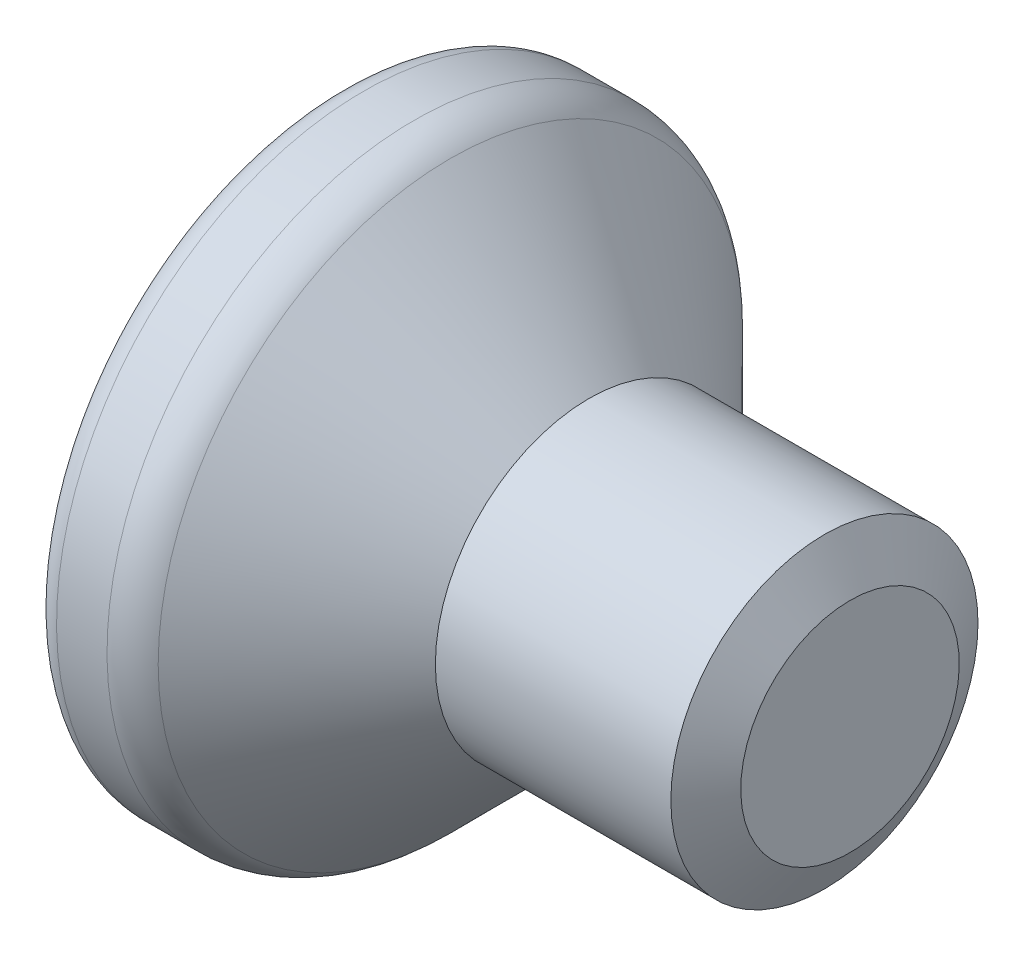
ISO-10303-21;
HEADER;
FILE_DESCRIPTION(('STEP AP214'),'2;1');
FILE_NAME('part.step','',(''),(''),'','','');
FILE_SCHEMA(('AUTOMOTIVE_DESIGN { 1 0 10303 214 1 1 1 1 }'));
ENDSEC;
DATA;
#1=APPLICATION_CONTEXT('core data for automotive mechanical design processes');
#2=APPLICATION_PROTOCOL_DEFINITION('international standard','automotive_design',2000,#1);
#3=PRODUCT_CONTEXT('',#1,'mechanical');
#4=PRODUCT('Part','Part','',(#3));
#5=PRODUCT_RELATED_PRODUCT_CATEGORY('part','',(#4));
#6=PRODUCT_DEFINITION_FORMATION('','',#4);
#7=PRODUCT_DEFINITION_CONTEXT('part definition',#1,'design');
#8=PRODUCT_DEFINITION('design','',#6,#7);
#9=PRODUCT_DEFINITION_SHAPE('','',#8);
#10=(LENGTH_UNIT() NAMED_UNIT(*) SI_UNIT(.MILLI.,.METRE.));
#11=(NAMED_UNIT(*) PLANE_ANGLE_UNIT() SI_UNIT($,.RADIAN.));
#12=(NAMED_UNIT(*) SI_UNIT($,.STERADIAN.) SOLID_ANGLE_UNIT());
#13=UNCERTAINTY_MEASURE_WITH_UNIT(LENGTH_MEASURE(1.E-05),#10,'distance_accuracy_value','');
#14=(GEOMETRIC_REPRESENTATION_CONTEXT(3) GLOBAL_UNCERTAINTY_ASSIGNED_CONTEXT((#13)) GLOBAL_UNIT_ASSIGNED_CONTEXT((#10,
#11,#12)) REPRESENTATION_CONTEXT('',''));
#15=CARTESIAN_POINT('',(0.,0.,0.));
#16=DIRECTION('',(0.,0.,1.));
#17=DIRECTION('',(1.,0.,0.));
#18=AXIS2_PLACEMENT_3D('',#15,#16,#17);
#19=CARTESIAN_POINT('',(5.,0.,0.));
#20=DIRECTION('',(1.,0.,0.));
#21=DIRECTION('',(0.,1.,0.));
#22=AXIS2_PLACEMENT_3D('',#19,#20,#21);
#23=CYLINDRICAL_SURFACE('',#22,6.);
#24=CARTESIAN_POINT('',(-3.51421356237312,0.,0.));
#25=DIRECTION('',(-1.,0.,0.));
#26=DIRECTION('',(0.,-1.,0.));
#27=AXIS2_PLACEMENT_3D('',#24,#25,#26);
#28=CIRCLE('',#27,6.);
#29=CARTESIAN_POINT('',(-3.51421356237312,-6.,0.));
#30=VERTEX_POINT('',#29);
#31=EDGE_CURVE('E154',#30,#30,#28,.T.);
#32=ORIENTED_EDGE('',*,*,#31,.T.);
#33=EDGE_LOOP('',(#32));
#34=FACE_BOUND('',#33,.T.);
#35=CARTESIAN_POINT('',(-4.5,0.,0.));
#36=DIRECTION('',(-1.,0.,0.));
#37=DIRECTION('',(0.,-1.,0.));
#38=AXIS2_PLACEMENT_3D('',#35,#36,#37);
#39=CIRCLE('',#38,6.);
#40=CARTESIAN_POINT('',(-4.5,-6.,0.));
#41=VERTEX_POINT('',#40);
#42=EDGE_CURVE('E145',#41,#41,#39,.F.);
#43=ORIENTED_EDGE('',*,*,#42,.T.);
#44=EDGE_LOOP('',(#43));
#45=FACE_BOUND('',#44,.T.);
#46=ADVANCED_FACE('F34',(#34,#45),#23,.T.);
#47=CARTESIAN_POINT('',(-0.0999999999999985,0.,0.));
#48=DIRECTION('',(-1.,0.,0.));
#49=DIRECTION('',(0.,-1.,0.));
#50=AXIS2_PLACEMENT_3D('',#47,#48,#49);
#51=CONICAL_SURFACE('',#50,3.,0.785398163397443);
#52=CARTESIAN_POINT('',(-2.80710678118658,0.,0.));
#53=DIRECTION('',(1.,0.,0.));
#54=DIRECTION('',(0.,1.,0.));
#55=AXIS2_PLACEMENT_3D('',#52,#53,#54);
#56=CIRCLE('',#55,5.70710678118655);
#57=CARTESIAN_POINT('',(-2.80710678118658,5.70710678118655,0.));
#58=VERTEX_POINT('',#57);
#59=EDGE_CURVE('E151',#58,#58,#56,.T.);
#60=ORIENTED_EDGE('',*,*,#59,.T.);
#61=EDGE_LOOP('',(#60));
#62=FACE_BOUND('',#61,.T.);
#63=CARTESIAN_POINT('',(-0.0999999999999985,0.,0.));
#64=DIRECTION('',(1.,0.,0.));
#65=DIRECTION('',(0.,1.,0.));
#66=AXIS2_PLACEMENT_3D('',#63,#64,#65);
#67=CIRCLE('',#66,3.);
#68=CARTESIAN_POINT('',(-0.0999999999999995,3.,0.));
#69=VERTEX_POINT('',#68);
#70=EDGE_CURVE('E137',#69,#69,#67,.T.);
#71=ORIENTED_EDGE('',*,*,#70,.F.);
#72=EDGE_LOOP('',(#71));
#73=FACE_BOUND('',#72,.T.);
#74=ADVANCED_FACE('F170',(#62,#73),#51,.T.);
#75=CARTESIAN_POINT('',(5.,0.,0.));
#76=DIRECTION('',(1.,0.,0.));
#77=DIRECTION('',(0.,1.,0.));
#78=AXIS2_PLACEMENT_3D('',#75,#76,#77);
#79=CYLINDRICAL_SURFACE('',#78,3.);
#80=CARTESIAN_POINT('',(4.5,0.,0.));
#81=DIRECTION('',(1.,0.,0.));
#82=DIRECTION('',(0.,1.,0.));
#83=AXIS2_PLACEMENT_3D('',#80,#81,#82);
#84=CIRCLE('',#83,3.);
#85=CARTESIAN_POINT('',(4.5,3.,0.));
#86=VERTEX_POINT('',#85);
#87=EDGE_CURVE('E11',#86,#86,#84,.F.);
#88=ORIENTED_EDGE('',*,*,#87,.T.);
#89=EDGE_LOOP('',(#88));
#90=FACE_BOUND('',#89,.T.);
#91=ORIENTED_EDGE('',*,*,#70,.T.);
#92=EDGE_LOOP('',(#91));
#93=FACE_BOUND('',#92,.T.);
#94=ADVANCED_FACE('F176',(#90,#93),#79,.T.);
#95=CARTESIAN_POINT('',(5.,3.,0.));
#96=DIRECTION('',(1.,0.,0.));
#97=DIRECTION('',(0.,1.,0.));
#98=AXIS2_PLACEMENT_3D('',#95,#96,#97);
#99=PLANE('',#98);
#100=CARTESIAN_POINT('',(5.,0.,0.));
#101=DIRECTION('',(1.,0.,0.));
#102=DIRECTION('',(0.,1.,0.));
#103=AXIS2_PLACEMENT_3D('',#100,#101,#102);
#104=CIRCLE('',#103,2.13397459621556);
#105=CARTESIAN_POINT('',(5.,2.13397459621556,0.));
#106=VERTEX_POINT('',#105);
#107=EDGE_CURVE('E43',#106,#106,#104,.T.);
#108=ORIENTED_EDGE('',*,*,#107,.T.);
#109=EDGE_LOOP('',(#108));
#110=FACE_BOUND('',#109,.T.);
#111=ADVANCED_FACE('F159',(#110),#99,.T.);
#112=CARTESIAN_POINT('',(-5.,0.,0.));
#113=DIRECTION('',(-1.,0.,0.));
#114=DIRECTION('',(0.,-1.,0.));
#115=AXIS2_PLACEMENT_3D('',#112,#113,#114);
#116=PLANE('',#115);
#117=DIRECTION('',(0.,0.5,-0.866025403784439));
#118=VECTOR('',#117,1.);
#119=CARTESIAN_POINT('',(-5.,1.15470053837925,2.));
#120=LINE('',#119,#118);
#121=CARTESIAN_POINT('',(-5.,1.15470053837925,2.));
#122=VERTEX_POINT('',#121);
#123=CARTESIAN_POINT('',(-5.,2.3094010767585,0.));
#124=VERTEX_POINT('',#123);
#125=EDGE_CURVE('E50',#122,#124,#120,.T.);
#126=ORIENTED_EDGE('',*,*,#125,.F.);
#127=DIRECTION('',(0.,1.,0.));
#128=VECTOR('',#127,1.);
#129=CARTESIAN_POINT('',(-5.,-1.15470053837925,2.));
#130=LINE('',#129,#128);
#131=CARTESIAN_POINT('',(-5.,-1.15470053837925,2.));
#132=VERTEX_POINT('',#131);
#133=EDGE_CURVE('E133',#132,#122,#130,.T.);
#134=ORIENTED_EDGE('',*,*,#133,.F.);
#135=DIRECTION('',(0.,0.5,0.866025403784439));
#136=VECTOR('',#135,1.);
#137=CARTESIAN_POINT('',(-5.,-2.30940107675851,0.));
#138=LINE('',#137,#136);
#139=CARTESIAN_POINT('',(-5.,-2.30940107675851,0.));
#140=VERTEX_POINT('',#139);
#141=EDGE_CURVE('E131',#140,#132,#138,.T.);
#142=ORIENTED_EDGE('',*,*,#141,.F.);
#143=DIRECTION('',(0.,-0.5,0.866025403784439));
#144=VECTOR('',#143,1.);
#145=CARTESIAN_POINT('',(-5.,-1.15470053837925,-2.));
#146=LINE('',#145,#144);
#147=CARTESIAN_POINT('',(-5.,-1.15470053837925,-2.));
#148=VERTEX_POINT('',#147);
#149=EDGE_CURVE('E98',#148,#140,#146,.T.);
#150=ORIENTED_EDGE('',*,*,#149,.F.);
#151=DIRECTION('',(0.,-1.,0.));
#152=VECTOR('',#151,1.);
#153=CARTESIAN_POINT('',(-5.,1.15470053837925,-2.));
#154=LINE('',#153,#152);
#155=CARTESIAN_POINT('',(-5.,1.15470053837925,-2.));
#156=VERTEX_POINT('',#155);
#157=EDGE_CURVE('E127',#156,#148,#154,.T.);
#158=ORIENTED_EDGE('',*,*,#157,.F.);
#159=DIRECTION('',(0.,-0.5,-0.866025403784439));
#160=VECTOR('',#159,1.);
#161=CARTESIAN_POINT('',(-5.,2.3094010767585,0.));
#162=LINE('',#161,#160);
#163=EDGE_CURVE('E124',#124,#156,#162,.T.);
#164=ORIENTED_EDGE('',*,*,#163,.F.);
#165=EDGE_LOOP('',(#126,#134,#142,#150,#158,#164));
#166=FACE_BOUND('',#165,.T.);
#167=CARTESIAN_POINT('',(-5.,0.,0.));
#168=DIRECTION('',(-1.,0.,0.));
#169=DIRECTION('',(0.,-1.,0.));
#170=AXIS2_PLACEMENT_3D('',#167,#168,#169);
#171=CIRCLE('',#170,5.5);
#172=CARTESIAN_POINT('',(-5.,-5.5,0.));
#173=VERTEX_POINT('',#172);
#174=EDGE_CURVE('E148',#173,#173,#171,.T.);
#175=ORIENTED_EDGE('',*,*,#174,.T.);
#176=EDGE_LOOP('',(#175));
#177=FACE_BOUND('',#176,.T.);
#178=ADVANCED_FACE('F185',(#166,#177),#116,.T.);
#179=CARTESIAN_POINT('',(-4.5,0.,0.));
#180=DIRECTION('',(-1.,0.,0.));
#181=DIRECTION('',(0.,-1.,0.));
#182=AXIS2_PLACEMENT_3D('',#179,#180,#181);
#183=TOROIDAL_SURFACE('',#182,5.5,0.5);
#184=ORIENTED_EDGE('',*,*,#174,.F.);
#185=EDGE_LOOP('',(#184));
#186=FACE_BOUND('',#185,.T.);
#187=ORIENTED_EDGE('',*,*,#42,.F.);
#188=EDGE_LOOP('',(#187));
#189=FACE_BOUND('',#188,.T.);
#190=ADVANCED_FACE('F182',(#186,#189),#183,.T.);
#191=CARTESIAN_POINT('',(-3.51421356237312,0.,0.));
#192=DIRECTION('',(-1.,0.,0.));
#193=DIRECTION('',(0.,-1.,0.));
#194=AXIS2_PLACEMENT_3D('',#191,#192,#193);
#195=TOROIDAL_SURFACE('',#194,5.,1.);
#196=ORIENTED_EDGE('',*,*,#31,.F.);
#197=EDGE_LOOP('',(#196));
#198=FACE_BOUND('',#197,.T.);
#199=ORIENTED_EDGE('',*,*,#59,.F.);
#200=EDGE_LOOP('',(#199));
#201=FACE_BOUND('',#200,.T.);
#202=ADVANCED_FACE('F184',(#198,#201),#195,.T.);
#203=CARTESIAN_POINT('',(-2.5,1.15470053837925,2.));
#204=DIRECTION('',(0.,0.866025403784439,0.5));
#205=DIRECTION('',(0.,-0.5,0.866025403784439));
#206=AXIS2_PLACEMENT_3D('',#203,#204,#205);
#207=PLANE('',#206);
#208=ORIENTED_EDGE('',*,*,#125,.T.);
#209=DIRECTION('',(-1.,0.,0.));
#210=VECTOR('',#209,1.);
#211=CARTESIAN_POINT('',(-2.5,2.3094010767585,0.));
#212=LINE('',#211,#210);
#213=CARTESIAN_POINT('',(-2.5,2.3094010767585,0.));
#214=VERTEX_POINT('',#213);
#215=EDGE_CURVE('E80',#214,#124,#212,.T.);
#216=ORIENTED_EDGE('',*,*,#215,.F.);
#217=DIRECTION('',(0.,0.5,-0.866025403784439));
#218=VECTOR('',#217,1.);
#219=CARTESIAN_POINT('',(-2.5,1.15470053837925,2.));
#220=LINE('',#219,#218);
#221=CARTESIAN_POINT('',(-2.5,1.15470053837925,2.));
#222=VERTEX_POINT('',#221);
#223=EDGE_CURVE('E135',#222,#214,#220,.T.);
#224=ORIENTED_EDGE('',*,*,#223,.F.);
#225=DIRECTION('',(-1.,0.,0.));
#226=VECTOR('',#225,1.);
#227=CARTESIAN_POINT('',(-2.5,1.15470053837925,2.));
#228=LINE('',#227,#226);
#229=EDGE_CURVE('E58',#222,#122,#228,.T.);
#230=ORIENTED_EDGE('',*,*,#229,.T.);
#231=EDGE_LOOP('',(#208,#216,#224,#230));
#232=FACE_BOUND('',#231,.T.);
#233=ADVANCED_FACE('F188',(#232),#207,.F.);
#234=CARTESIAN_POINT('',(-2.5,-1.15470053837925,2.));
#235=DIRECTION('',(0.,0.,1.));
#236=DIRECTION('',(0.,-1.,0.));
#237=AXIS2_PLACEMENT_3D('',#234,#235,#236);
#238=PLANE('',#237);
#239=ORIENTED_EDGE('',*,*,#133,.T.);
#240=ORIENTED_EDGE('',*,*,#229,.F.);
#241=DIRECTION('',(0.,1.,0.));
#242=VECTOR('',#241,1.);
#243=CARTESIAN_POINT('',(-2.5,-1.15470053837925,2.));
#244=LINE('',#243,#242);
#245=CARTESIAN_POINT('',(-2.5,-1.15470053837925,2.));
#246=VERTEX_POINT('',#245);
#247=EDGE_CURVE('E110',#246,#222,#244,.T.);
#248=ORIENTED_EDGE('',*,*,#247,.F.);
#249=DIRECTION('',(-1.,0.,0.));
#250=VECTOR('',#249,1.);
#251=CARTESIAN_POINT('',(-2.5,-1.15470053837925,2.));
#252=LINE('',#251,#250);
#253=EDGE_CURVE('E102',#246,#132,#252,.T.);
#254=ORIENTED_EDGE('',*,*,#253,.T.);
#255=EDGE_LOOP('',(#239,#240,#248,#254));
#256=FACE_BOUND('',#255,.T.);
#257=ADVANCED_FACE('F193',(#256),#238,.F.);
#258=CARTESIAN_POINT('',(-2.5,-2.3094010767585,0.));
#259=DIRECTION('',(0.,-0.866025403784439,0.5));
#260=DIRECTION('',(0.,-0.5,-0.866025403784439));
#261=AXIS2_PLACEMENT_3D('',#258,#259,#260);
#262=PLANE('',#261);
#263=ORIENTED_EDGE('',*,*,#141,.T.);
#264=ORIENTED_EDGE('',*,*,#253,.F.);
#265=DIRECTION('',(0.,0.5,0.866025403784439));
#266=VECTOR('',#265,1.);
#267=CARTESIAN_POINT('',(-2.5,-2.3094010767585,0.));
#268=LINE('',#267,#266);
#269=CARTESIAN_POINT('',(-2.5,-2.3094010767585,0.));
#270=VERTEX_POINT('',#269);
#271=EDGE_CURVE('E106',#270,#246,#268,.T.);
#272=ORIENTED_EDGE('',*,*,#271,.F.);
#273=DIRECTION('',(-1.,0.,0.));
#274=VECTOR('',#273,1.);
#275=CARTESIAN_POINT('',(-2.5,-2.3094010767585,0.));
#276=LINE('',#275,#274);
#277=EDGE_CURVE('E91',#270,#140,#276,.T.);
#278=ORIENTED_EDGE('',*,*,#277,.T.);
#279=EDGE_LOOP('',(#263,#264,#272,#278));
#280=FACE_BOUND('',#279,.T.);
#281=ADVANCED_FACE('F107',(#280),#262,.F.);
#282=CARTESIAN_POINT('',(-2.5,-1.15470053837925,-2.));
#283=DIRECTION('',(0.,-0.866025403784439,-0.5));
#284=DIRECTION('',(0.,0.5,-0.866025403784439));
#285=AXIS2_PLACEMENT_3D('',#282,#283,#284);
#286=PLANE('',#285);
#287=ORIENTED_EDGE('',*,*,#149,.T.);
#288=ORIENTED_EDGE('',*,*,#277,.F.);
#289=DIRECTION('',(0.,-0.5,0.866025403784439));
#290=VECTOR('',#289,1.);
#291=CARTESIAN_POINT('',(-2.5,-1.15470053837925,-2.));
#292=LINE('',#291,#290);
#293=CARTESIAN_POINT('',(-2.5,-1.15470053837925,-2.));
#294=VERTEX_POINT('',#293);
#295=EDGE_CURVE('E95',#294,#270,#292,.T.);
#296=ORIENTED_EDGE('',*,*,#295,.F.);
#297=DIRECTION('',(-1.,0.,0.));
#298=VECTOR('',#297,1.);
#299=CARTESIAN_POINT('',(-2.5,-1.15470053837925,-2.));
#300=LINE('',#299,#298);
#301=EDGE_CURVE('E103',#294,#148,#300,.T.);
#302=ORIENTED_EDGE('',*,*,#301,.T.);
#303=EDGE_LOOP('',(#287,#288,#296,#302));
#304=FACE_BOUND('',#303,.T.);
#305=ADVANCED_FACE('F93',(#304),#286,.F.);
#306=CARTESIAN_POINT('',(-2.5,1.15470053837925,-2.));
#307=DIRECTION('',(0.,0.,-1.));
#308=DIRECTION('',(-1.,0.,0.));
#309=AXIS2_PLACEMENT_3D('',#306,#307,#308);
#310=PLANE('',#309);
#311=ORIENTED_EDGE('',*,*,#157,.T.);
#312=ORIENTED_EDGE('',*,*,#301,.F.);
#313=DIRECTION('',(0.,-1.,0.));
#314=VECTOR('',#313,1.);
#315=CARTESIAN_POINT('',(-2.5,1.15470053837925,-2.));
#316=LINE('',#315,#314);
#317=CARTESIAN_POINT('',(-2.5,1.15470053837925,-2.));
#318=VERTEX_POINT('',#317);
#319=EDGE_CURVE('E116',#318,#294,#316,.T.);
#320=ORIENTED_EDGE('',*,*,#319,.F.);
#321=DIRECTION('',(-1.,0.,0.));
#322=VECTOR('',#321,1.);
#323=CARTESIAN_POINT('',(-2.5,1.15470053837925,-2.));
#324=LINE('',#323,#322);
#325=EDGE_CURVE('E140',#318,#156,#324,.T.);
#326=ORIENTED_EDGE('',*,*,#325,.T.);
#327=EDGE_LOOP('',(#311,#312,#320,#326));
#328=FACE_BOUND('',#327,.T.);
#329=ADVANCED_FACE('F213',(#328),#310,.F.);
#330=CARTESIAN_POINT('',(-2.5,2.3094010767585,0.));
#331=DIRECTION('',(0.,0.866025403784439,-0.5));
#332=DIRECTION('',(0.,0.5,0.866025403784439));
#333=AXIS2_PLACEMENT_3D('',#330,#331,#332);
#334=PLANE('',#333);
#335=ORIENTED_EDGE('',*,*,#163,.T.);
#336=ORIENTED_EDGE('',*,*,#325,.F.);
#337=DIRECTION('',(0.,-0.5,-0.866025403784439));
#338=VECTOR('',#337,1.);
#339=CARTESIAN_POINT('',(-2.5,2.3094010767585,0.));
#340=LINE('',#339,#338);
#341=EDGE_CURVE('E118',#214,#318,#340,.T.);
#342=ORIENTED_EDGE('',*,*,#341,.F.);
#343=ORIENTED_EDGE('',*,*,#215,.T.);
#344=EDGE_LOOP('',(#335,#336,#342,#343));
#345=FACE_BOUND('',#344,.T.);
#346=ADVANCED_FACE('F166',(#345),#334,.F.);
#347=CARTESIAN_POINT('',(-2.5,0.,0.));
#348=DIRECTION('',(-1.,0.,0.));
#349=DIRECTION('',(0.,-1.,0.));
#350=AXIS2_PLACEMENT_3D('',#347,#348,#349);
#351=PLANE('',#350);
#352=ORIENTED_EDGE('',*,*,#223,.T.);
#353=ORIENTED_EDGE('',*,*,#341,.T.);
#354=ORIENTED_EDGE('',*,*,#319,.T.);
#355=ORIENTED_EDGE('',*,*,#295,.T.);
#356=ORIENTED_EDGE('',*,*,#271,.T.);
#357=ORIENTED_EDGE('',*,*,#247,.T.);
#358=EDGE_LOOP('',(#352,#353,#354,#355,#356,#357));
#359=FACE_BOUND('',#358,.T.);
#360=ADVANCED_FACE('F113',(#359),#351,.T.);
#361=CARTESIAN_POINT('',(5.,0.,0.));
#362=DIRECTION('',(-1.,0.,0.));
#363=DIRECTION('',(0.,-1.,0.));
#364=AXIS2_PLACEMENT_3D('',#361,#362,#363);
#365=CONICAL_SURFACE('',#364,2.13397459621556,1.0471975511966);
#366=ORIENTED_EDGE('',*,*,#87,.F.);
#367=EDGE_LOOP('',(#366));
#368=FACE_BOUND('',#367,.T.);
#369=ORIENTED_EDGE('',*,*,#107,.F.);
#370=EDGE_LOOP('',(#369));
#371=FACE_BOUND('',#370,.T.);
#372=ADVANCED_FACE('F37',(#368,#371),#365,.T.);
#373=CLOSED_SHELL('',(#46,#74,#94,#111,#178,#190,#202,#233,#257,#281,#305,#329,#346,#360,#372));
#374=MANIFOLD_SOLID_BREP('B2',#373);
#375=ADVANCED_BREP_SHAPE_REPRESENTATION('',(#18,#374),#14);
#376=SHAPE_DEFINITION_REPRESENTATION(#9,#375);
ENDSEC;
END-ISO-10303-21;
